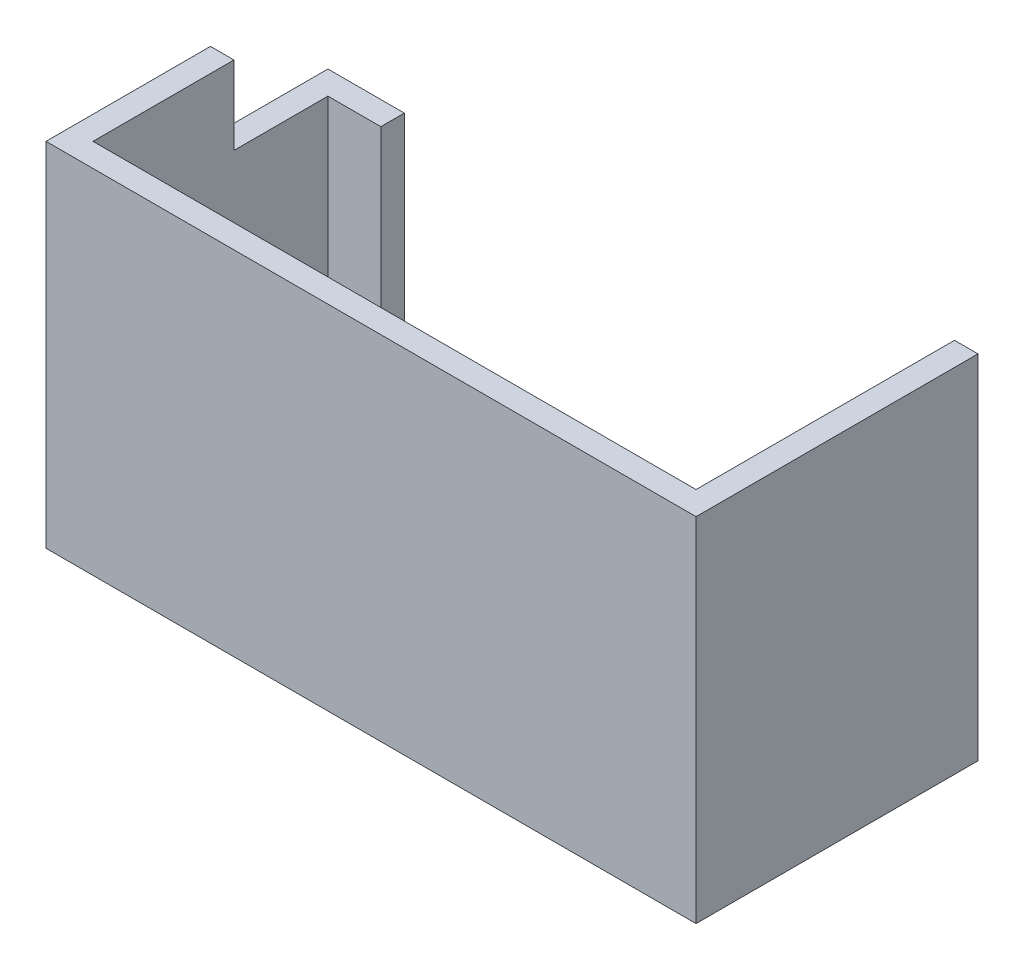
ISO-10303-21;
HEADER;
FILE_DESCRIPTION(('STEP AP214'),'2;1');
FILE_NAME('part.step','',(''),(''),'','','');
FILE_SCHEMA(('AUTOMOTIVE_DESIGN { 1 0 10303 214 1 1 1 1 }'));
ENDSEC;
DATA;
#1=APPLICATION_CONTEXT('core data for automotive mechanical design processes');
#2=APPLICATION_PROTOCOL_DEFINITION('international standard','automotive_design',2000,#1);
#3=PRODUCT_CONTEXT('',#1,'mechanical');
#4=PRODUCT('Part','Part','',(#3));
#5=PRODUCT_RELATED_PRODUCT_CATEGORY('part','',(#4));
#6=PRODUCT_DEFINITION_FORMATION('','',#4);
#7=PRODUCT_DEFINITION_CONTEXT('part definition',#1,'design');
#8=PRODUCT_DEFINITION('design','',#6,#7);
#9=PRODUCT_DEFINITION_SHAPE('','',#8);
#10=(LENGTH_UNIT() NAMED_UNIT(*) SI_UNIT(.MILLI.,.METRE.));
#11=(NAMED_UNIT(*) PLANE_ANGLE_UNIT() SI_UNIT($,.RADIAN.));
#12=(NAMED_UNIT(*) SI_UNIT($,.STERADIAN.) SOLID_ANGLE_UNIT());
#13=UNCERTAINTY_MEASURE_WITH_UNIT(LENGTH_MEASURE(1.E-05),#10,'distance_accuracy_value','');
#14=(GEOMETRIC_REPRESENTATION_CONTEXT(3) GLOBAL_UNCERTAINTY_ASSIGNED_CONTEXT((#13)) GLOBAL_UNIT_ASSIGNED_CONTEXT((#10,
#11,#12)) REPRESENTATION_CONTEXT('',''));
#15=CARTESIAN_POINT('',(0.,0.,0.));
#16=DIRECTION('',(0.,0.,1.));
#17=DIRECTION('',(1.,0.,0.));
#18=AXIS2_PLACEMENT_3D('',#15,#16,#17);
#19=CARTESIAN_POINT('',(0.,45.,0.));
#20=DIRECTION('',(0.,1.,0.));
#21=DIRECTION('',(0.,0.,1.));
#22=AXIS2_PLACEMENT_3D('',#19,#20,#21);
#23=PLANE('',#22);
#24=DIRECTION('',(-1.,0.,0.));
#25=VECTOR('',#24,1.);
#26=CARTESIAN_POINT('',(80.,45.,-33.));
#27=LINE('',#26,#25);
#28=CARTESIAN_POINT('',(80.,45.,-33.));
#29=VERTEX_POINT('',#28);
#30=CARTESIAN_POINT('',(77.,45.,-33.));
#31=VERTEX_POINT('',#30);
#32=EDGE_CURVE('E212',#29,#31,#27,.T.);
#33=ORIENTED_EDGE('',*,*,#32,.T.);
#34=DIRECTION('',(0.,0.,1.));
#35=VECTOR('',#34,1.);
#36=CARTESIAN_POINT('',(77.,45.,0.));
#37=LINE('',#36,#35);
#38=CARTESIAN_POINT('',(77.,45.,0.));
#39=VERTEX_POINT('',#38);
#40=EDGE_CURVE('E259',#31,#39,#37,.T.);
#41=ORIENTED_EDGE('',*,*,#40,.T.);
#42=DIRECTION('',(-1.,0.,0.));
#43=VECTOR('',#42,1.);
#44=CARTESIAN_POINT('',(0.,45.,0.));
#45=LINE('',#44,#43);
#46=CARTESIAN_POINT('',(0.,45.,0.));
#47=VERTEX_POINT('',#46);
#48=EDGE_CURVE('E256',#39,#47,#45,.T.);
#49=ORIENTED_EDGE('',*,*,#48,.T.);
#50=DIRECTION('',(0.,0.,-1.));
#51=VECTOR('',#50,1.);
#52=CARTESIAN_POINT('',(0.,45.,-30.));
#53=LINE('',#52,#51);
#54=CARTESIAN_POINT('',(0.,45.,-18.));
#55=VERTEX_POINT('',#54);
#56=EDGE_CURVE('E248',#47,#55,#53,.T.);
#57=ORIENTED_EDGE('',*,*,#56,.T.);
#58=DIRECTION('',(1.,0.,0.));
#59=VECTOR('',#58,1.);
#60=CARTESIAN_POINT('',(-3.,45.,-18.));
#61=LINE('',#60,#59);
#62=CARTESIAN_POINT('',(-3.,45.,-18.));
#63=VERTEX_POINT('',#62);
#64=EDGE_CURVE('E281',#63,#55,#61,.T.);
#65=ORIENTED_EDGE('',*,*,#64,.F.);
#66=DIRECTION('',(0.,0.,1.));
#67=VECTOR('',#66,1.);
#68=CARTESIAN_POINT('',(-3.,45.,-33.));
#69=LINE('',#68,#67);
#70=CARTESIAN_POINT('',(-3.,45.,3.));
#71=VERTEX_POINT('',#70);
#72=EDGE_CURVE('E247',#63,#71,#69,.T.);
#73=ORIENTED_EDGE('',*,*,#72,.T.);
#74=DIRECTION('',(1.,0.,0.));
#75=VECTOR('',#74,1.);
#76=CARTESIAN_POINT('',(-3.,45.,3.));
#77=LINE('',#76,#75);
#78=CARTESIAN_POINT('',(80.,45.,3.));
#79=VERTEX_POINT('',#78);
#80=EDGE_CURVE('E226',#71,#79,#77,.T.);
#81=ORIENTED_EDGE('',*,*,#80,.T.);
#82=DIRECTION('',(0.,0.,-1.));
#83=VECTOR('',#82,1.);
#84=CARTESIAN_POINT('',(80.,45.,3.));
#85=LINE('',#84,#83);
#86=EDGE_CURVE('E220',#79,#29,#85,.T.);
#87=ORIENTED_EDGE('',*,*,#86,.T.);
#88=EDGE_LOOP('',(#33,#41,#49,#57,#65,#73,#81,#87));
#89=FACE_BOUND('',#88,.T.);
#90=ADVANCED_FACE('F37',(#89),#23,.T.);
#91=CARTESIAN_POINT('',(0.,5.,0.));
#92=DIRECTION('',(1.,0.,0.));
#93=DIRECTION('',(0.,0.,-1.));
#94=AXIS2_PLACEMENT_3D('',#91,#92,#93);
#95=PLANE('',#94);
#96=DIRECTION('',(0.,0.,-1.));
#97=VECTOR('',#96,1.);
#98=CARTESIAN_POINT('',(0.,35.,0.));
#99=LINE('',#98,#97);
#100=CARTESIAN_POINT('',(0.,35.,-18.));
#101=VERTEX_POINT('',#100);
#102=CARTESIAN_POINT('',(0.,35.,-30.));
#103=VERTEX_POINT('',#102);
#104=EDGE_CURVE('E273',#101,#103,#99,.T.);
#105=ORIENTED_EDGE('',*,*,#104,.F.);
#106=DIRECTION('',(0.,1.,0.));
#107=VECTOR('',#106,1.);
#108=CARTESIAN_POINT('',(0.,5.,-18.));
#109=LINE('',#108,#107);
#110=EDGE_CURVE('E277',#101,#55,#109,.T.);
#111=ORIENTED_EDGE('',*,*,#110,.T.);
#112=ORIENTED_EDGE('',*,*,#56,.F.);
#113=DIRECTION('',(0.,-1.,0.));
#114=VECTOR('',#113,1.);
#115=CARTESIAN_POINT('',(0.,5.,0.));
#116=LINE('',#115,#114);
#117=CARTESIAN_POINT('',(0.,1.,0.));
#118=VERTEX_POINT('',#117);
#119=EDGE_CURVE('E181',#47,#118,#116,.T.);
#120=ORIENTED_EDGE('',*,*,#119,.T.);
#121=DIRECTION('',(0.,0.,-1.));
#122=VECTOR('',#121,1.);
#123=CARTESIAN_POINT('',(0.,1.,0.));
#124=LINE('',#123,#122);
#125=CARTESIAN_POINT('',(0.,1.,-30.));
#126=VERTEX_POINT('',#125);
#127=EDGE_CURVE('E252',#118,#126,#124,.T.);
#128=ORIENTED_EDGE('',*,*,#127,.T.);
#129=DIRECTION('',(0.,-1.,0.));
#130=VECTOR('',#129,1.);
#131=CARTESIAN_POINT('',(0.,5.,-30.));
#132=LINE('',#131,#130);
#133=EDGE_CURVE('E175',#103,#126,#132,.T.);
#134=ORIENTED_EDGE('',*,*,#133,.F.);
#135=EDGE_LOOP('',(#105,#111,#112,#120,#128,#134));
#136=FACE_BOUND('',#135,.T.);
#137=ADVANCED_FACE('F298',(#136),#95,.T.);
#138=CARTESIAN_POINT('',(0.,5.,0.));
#139=DIRECTION('',(0.,0.,-1.));
#140=DIRECTION('',(-1.,0.,0.));
#141=AXIS2_PLACEMENT_3D('',#138,#139,#140);
#142=PLANE('',#141);
#143=DIRECTION('',(0.,-1.,0.));
#144=VECTOR('',#143,1.);
#145=CARTESIAN_POINT('',(77.,5.,0.));
#146=LINE('',#145,#144);
#147=CARTESIAN_POINT('',(77.,1.,0.));
#148=VERTEX_POINT('',#147);
#149=EDGE_CURVE('E178',#39,#148,#146,.T.);
#150=ORIENTED_EDGE('',*,*,#149,.T.);
#151=DIRECTION('',(-1.,0.,0.));
#152=VECTOR('',#151,1.);
#153=CARTESIAN_POINT('',(0.,1.,0.));
#154=LINE('',#153,#152);
#155=EDGE_CURVE('E267',#148,#118,#154,.T.);
#156=ORIENTED_EDGE('',*,*,#155,.T.);
#157=ORIENTED_EDGE('',*,*,#119,.F.);
#158=ORIENTED_EDGE('',*,*,#48,.F.);
#159=EDGE_LOOP('',(#150,#156,#157,#158));
#160=FACE_BOUND('',#159,.T.);
#161=ADVANCED_FACE('F304',(#160),#142,.T.);
#162=CARTESIAN_POINT('',(77.,5.,0.));
#163=DIRECTION('',(-1.,0.,0.));
#164=DIRECTION('',(0.,0.,1.));
#165=AXIS2_PLACEMENT_3D('',#162,#163,#164);
#166=PLANE('',#165);
#167=ORIENTED_EDGE('',*,*,#40,.F.);
#168=DIRECTION('',(0.,-1.,0.));
#169=VECTOR('',#168,1.);
#170=CARTESIAN_POINT('',(77.,24.4,-33.));
#171=LINE('',#170,#169);
#172=CARTESIAN_POINT('',(77.,24.4,-33.));
#173=VERTEX_POINT('',#172);
#174=EDGE_CURVE('E149',#31,#173,#171,.T.);
#175=ORIENTED_EDGE('',*,*,#174,.T.);
#176=DIRECTION('',(0.,0.,-1.));
#177=VECTOR('',#176,1.);
#178=CARTESIAN_POINT('',(77.,24.4,3.001));
#179=LINE('',#178,#177);
#180=CARTESIAN_POINT('',(77.,24.4,-30.));
#181=VERTEX_POINT('',#180);
#182=EDGE_CURVE('E159',#181,#173,#179,.T.);
#183=ORIENTED_EDGE('',*,*,#182,.F.);
#184=DIRECTION('',(0.,-1.,0.));
#185=VECTOR('',#184,1.);
#186=CARTESIAN_POINT('',(77.,5.,-30.));
#187=LINE('',#186,#185);
#188=CARTESIAN_POINT('',(77.,1.,-30.));
#189=VERTEX_POINT('',#188);
#190=EDGE_CURVE('E157',#181,#189,#187,.T.);
#191=ORIENTED_EDGE('',*,*,#190,.T.);
#192=DIRECTION('',(0.,0.,1.));
#193=VECTOR('',#192,1.);
#194=CARTESIAN_POINT('',(77.,1.,0.));
#195=LINE('',#194,#193);
#196=EDGE_CURVE('E270',#189,#148,#195,.T.);
#197=ORIENTED_EDGE('',*,*,#196,.T.);
#198=ORIENTED_EDGE('',*,*,#149,.F.);
#199=EDGE_LOOP('',(#167,#175,#183,#191,#197,#198));
#200=FACE_BOUND('',#199,.T.);
#201=ADVANCED_FACE('F290',(#200),#166,.T.);
#202=CARTESIAN_POINT('',(0.,5.,-30.));
#203=DIRECTION('',(0.,0.,1.));
#204=DIRECTION('',(1.,0.,0.));
#205=AXIS2_PLACEMENT_3D('',#202,#203,#204);
#206=PLANE('',#205);
#207=DIRECTION('',(-1.,0.,0.));
#208=VECTOR('',#207,1.);
#209=CARTESIAN_POINT('',(77.,24.4,-30.));
#210=LINE('',#209,#208);
#211=CARTESIAN_POINT('',(70.2476744816459,24.4,-30.));
#212=VERTEX_POINT('',#211);
#213=EDGE_CURVE('E144',#181,#212,#210,.T.);
#214=ORIENTED_EDGE('',*,*,#213,.T.);
#215=DIRECTION('',(0.,-1.,0.));
#216=VECTOR('',#215,1.);
#217=CARTESIAN_POINT('',(70.2476744816459,45.,-30.));
#218=LINE('',#217,#216);
#219=CARTESIAN_POINT('',(70.2476744816459,5.,-30.));
#220=VERTEX_POINT('',#219);
#221=EDGE_CURVE('E155',#212,#220,#218,.T.);
#222=ORIENTED_EDGE('',*,*,#221,.T.);
#223=DIRECTION('',(-1.,0.,0.));
#224=VECTOR('',#223,1.);
#225=CARTESIAN_POINT('',(0.,5.,-30.));
#226=LINE('',#225,#224);
#227=CARTESIAN_POINT('',(6.7523255183541,5.,-30.));
#228=VERTEX_POINT('',#227);
#229=EDGE_CURVE('E168',#220,#228,#226,.T.);
#230=ORIENTED_EDGE('',*,*,#229,.T.);
#231=DIRECTION('',(0.,-1.,0.));
#232=VECTOR('',#231,1.);
#233=CARTESIAN_POINT('',(6.7523255183541,45.,-30.));
#234=LINE('',#233,#232);
#235=CARTESIAN_POINT('',(6.7523255183541,35.,-30.));
#236=VERTEX_POINT('',#235);
#237=EDGE_CURVE('E166',#236,#228,#234,.T.);
#238=ORIENTED_EDGE('',*,*,#237,.F.);
#239=DIRECTION('',(1.,0.,0.));
#240=VECTOR('',#239,1.);
#241=CARTESIAN_POINT('',(0.,35.,-30.));
#242=LINE('',#241,#240);
#243=EDGE_CURVE('E275',#103,#236,#242,.T.);
#244=ORIENTED_EDGE('',*,*,#243,.F.);
#245=ORIENTED_EDGE('',*,*,#133,.T.);
#246=DIRECTION('',(1.,0.,0.));
#247=VECTOR('',#246,1.);
#248=CARTESIAN_POINT('',(0.,1.,-30.));
#249=LINE('',#248,#247);
#250=EDGE_CURVE('E11',#126,#189,#249,.T.);
#251=ORIENTED_EDGE('',*,*,#250,.T.);
#252=ORIENTED_EDGE('',*,*,#190,.F.);
#253=EDGE_LOOP('',(#214,#222,#230,#238,#244,#245,#251,#252));
#254=FACE_BOUND('',#253,.T.);
#255=ADVANCED_FACE('F153',(#254),#206,.T.);
#256=CARTESIAN_POINT('',(0.,5.,0.));
#257=DIRECTION('',(0.,-1.,0.));
#258=DIRECTION('',(0.,0.,-1.));
#259=AXIS2_PLACEMENT_3D('',#256,#257,#258);
#260=PLANE('',#259);
#261=DIRECTION('',(0.,0.,-1.));
#262=VECTOR('',#261,1.);
#263=CARTESIAN_POINT('',(6.7523255183541,5.,-33.));
#264=LINE('',#263,#262);
#265=CARTESIAN_POINT('',(6.7523255183541,5.,-33.));
#266=VERTEX_POINT('',#265);
#267=EDGE_CURVE('E246',#228,#266,#264,.T.);
#268=ORIENTED_EDGE('',*,*,#267,.F.);
#269=ORIENTED_EDGE('',*,*,#229,.F.);
#270=DIRECTION('',(0.,0.,1.));
#271=VECTOR('',#270,1.);
#272=CARTESIAN_POINT('',(70.2476744816459,5.,-33.));
#273=LINE('',#272,#271);
#274=CARTESIAN_POINT('',(70.2476744816459,5.,-33.));
#275=VERTEX_POINT('',#274);
#276=EDGE_CURVE('E164',#275,#220,#273,.T.);
#277=ORIENTED_EDGE('',*,*,#276,.F.);
#278=DIRECTION('',(-1.,0.,0.));
#279=VECTOR('',#278,1.);
#280=CARTESIAN_POINT('',(-3.,5.,-33.));
#281=LINE('',#280,#279);
#282=EDGE_CURVE('E185',#275,#266,#281,.T.);
#283=ORIENTED_EDGE('',*,*,#282,.T.);
#284=EDGE_LOOP('',(#268,#269,#277,#283));
#285=FACE_BOUND('',#284,.T.);
#286=ADVANCED_FACE('F292',(#285),#260,.F.);
#287=CARTESIAN_POINT('',(0.,0.,0.));
#288=DIRECTION('',(0.,-1.,0.));
#289=DIRECTION('',(0.,0.,-1.));
#290=AXIS2_PLACEMENT_3D('',#287,#288,#289);
#291=PLANE('',#290);
#292=DIRECTION('',(0.,0.,-1.));
#293=VECTOR('',#292,1.);
#294=CARTESIAN_POINT('',(80.,0.,3.));
#295=LINE('',#294,#293);
#296=CARTESIAN_POINT('',(80.,0.,3.));
#297=VERTEX_POINT('',#296);
#298=CARTESIAN_POINT('',(80.,0.,-33.));
#299=VERTEX_POINT('',#298);
#300=EDGE_CURVE('E184',#297,#299,#295,.T.);
#301=ORIENTED_EDGE('',*,*,#300,.F.);
#302=DIRECTION('',(1.,0.,0.));
#303=VECTOR('',#302,1.);
#304=CARTESIAN_POINT('',(-3.,0.,3.));
#305=LINE('',#304,#303);
#306=CARTESIAN_POINT('',(-3.,0.,3.));
#307=VERTEX_POINT('',#306);
#308=EDGE_CURVE('E189',#307,#297,#305,.T.);
#309=ORIENTED_EDGE('',*,*,#308,.F.);
#310=DIRECTION('',(0.,0.,1.));
#311=VECTOR('',#310,1.);
#312=CARTESIAN_POINT('',(-3.,0.,3.));
#313=LINE('',#312,#311);
#314=CARTESIAN_POINT('',(-3.,0.,-33.));
#315=VERTEX_POINT('',#314);
#316=EDGE_CURVE('E195',#315,#307,#313,.T.);
#317=ORIENTED_EDGE('',*,*,#316,.F.);
#318=DIRECTION('',(-1.,0.,0.));
#319=VECTOR('',#318,1.);
#320=CARTESIAN_POINT('',(-3.,0.,-33.));
#321=LINE('',#320,#319);
#322=EDGE_CURVE('E192',#299,#315,#321,.T.);
#323=ORIENTED_EDGE('',*,*,#322,.F.);
#324=EDGE_LOOP('',(#301,#309,#317,#323));
#325=FACE_BOUND('',#324,.T.);
#326=ADVANCED_FACE('F218',(#325),#291,.T.);
#327=CARTESIAN_POINT('',(80.,5.,3.));
#328=DIRECTION('',(-1.,0.,0.));
#329=DIRECTION('',(0.,0.,1.));
#330=AXIS2_PLACEMENT_3D('',#327,#328,#329);
#331=PLANE('',#330);
#332=ORIENTED_EDGE('',*,*,#300,.T.);
#333=DIRECTION('',(0.,-1.,0.));
#334=VECTOR('',#333,1.);
#335=CARTESIAN_POINT('',(80.,5.,-33.));
#336=LINE('',#335,#334);
#337=EDGE_CURVE('E45',#29,#299,#336,.T.);
#338=ORIENTED_EDGE('',*,*,#337,.F.);
#339=ORIENTED_EDGE('',*,*,#86,.F.);
#340=DIRECTION('',(0.,-1.,0.));
#341=VECTOR('',#340,1.);
#342=CARTESIAN_POINT('',(80.,5.,3.));
#343=LINE('',#342,#341);
#344=EDGE_CURVE('E188',#79,#297,#343,.T.);
#345=ORIENTED_EDGE('',*,*,#344,.T.);
#346=EDGE_LOOP('',(#332,#338,#339,#345));
#347=FACE_BOUND('',#346,.T.);
#348=ADVANCED_FACE('F39',(#347),#331,.F.);
#349=CARTESIAN_POINT('',(-3.,5.,-33.));
#350=DIRECTION('',(0.,0.,1.));
#351=DIRECTION('',(1.,0.,0.));
#352=AXIS2_PLACEMENT_3D('',#349,#350,#351);
#353=PLANE('',#352);
#354=DIRECTION('',(0.,-1.,0.));
#355=VECTOR('',#354,1.);
#356=CARTESIAN_POINT('',(70.2476744816459,45.,-33.));
#357=LINE('',#356,#355);
#358=CARTESIAN_POINT('',(70.2476744816459,24.4,-33.));
#359=VERTEX_POINT('',#358);
#360=EDGE_CURVE('E165',#359,#275,#357,.T.);
#361=ORIENTED_EDGE('',*,*,#360,.F.);
#362=DIRECTION('',(-1.,0.,0.));
#363=VECTOR('',#362,1.);
#364=CARTESIAN_POINT('',(77.,24.4,-33.));
#365=LINE('',#364,#363);
#366=EDGE_CURVE('E52',#173,#359,#365,.T.);
#367=ORIENTED_EDGE('',*,*,#366,.F.);
#368=ORIENTED_EDGE('',*,*,#174,.F.);
#369=ORIENTED_EDGE('',*,*,#32,.F.);
#370=ORIENTED_EDGE('',*,*,#337,.T.);
#371=ORIENTED_EDGE('',*,*,#322,.T.);
#372=DIRECTION('',(0.,-1.,0.));
#373=VECTOR('',#372,1.);
#374=CARTESIAN_POINT('',(-3.,5.,-33.));
#375=LINE('',#374,#373);
#376=CARTESIAN_POINT('',(-3.,35.,-33.));
#377=VERTEX_POINT('',#376);
#378=EDGE_CURVE('E203',#377,#315,#375,.T.);
#379=ORIENTED_EDGE('',*,*,#378,.F.);
#380=DIRECTION('',(-1.,0.,0.));
#381=VECTOR('',#380,1.);
#382=CARTESIAN_POINT('',(-3.,35.,-33.));
#383=LINE('',#382,#381);
#384=CARTESIAN_POINT('',(6.7523255183541,35.,-33.));
#385=VERTEX_POINT('',#384);
#386=EDGE_CURVE('E158',#385,#377,#383,.T.);
#387=ORIENTED_EDGE('',*,*,#386,.F.);
#388=DIRECTION('',(0.,-1.,0.));
#389=VECTOR('',#388,1.);
#390=CARTESIAN_POINT('',(6.7523255183541,45.,-33.));
#391=LINE('',#390,#389);
#392=EDGE_CURVE('E170',#385,#266,#391,.T.);
#393=ORIENTED_EDGE('',*,*,#392,.T.);
#394=ORIENTED_EDGE('',*,*,#282,.F.);
#395=EDGE_LOOP('',(#361,#367,#368,#369,#370,#371,#379,#387,#393,#394));
#396=FACE_BOUND('',#395,.T.);
#397=ADVANCED_FACE('F207',(#396),#353,.F.);
#398=CARTESIAN_POINT('',(-3.,5.,3.));
#399=DIRECTION('',(1.,0.,0.));
#400=DIRECTION('',(0.,0.,-1.));
#401=AXIS2_PLACEMENT_3D('',#398,#399,#400);
#402=PLANE('',#401);
#403=DIRECTION('',(0.,1.,0.));
#404=VECTOR('',#403,1.);
#405=CARTESIAN_POINT('',(-3.,35.,-18.));
#406=LINE('',#405,#404);
#407=CARTESIAN_POINT('',(-3.,35.,-18.));
#408=VERTEX_POINT('',#407);
#409=EDGE_CURVE('E60',#408,#63,#406,.T.);
#410=ORIENTED_EDGE('',*,*,#409,.F.);
#411=DIRECTION('',(0.,0.,-1.));
#412=VECTOR('',#411,1.);
#413=CARTESIAN_POINT('',(-3.,35.,-18.));
#414=LINE('',#413,#412);
#415=EDGE_CURVE('E232',#408,#377,#414,.T.);
#416=ORIENTED_EDGE('',*,*,#415,.T.);
#417=ORIENTED_EDGE('',*,*,#378,.T.);
#418=ORIENTED_EDGE('',*,*,#316,.T.);
#419=DIRECTION('',(0.,-1.,0.));
#420=VECTOR('',#419,1.);
#421=CARTESIAN_POINT('',(-3.,5.,3.));
#422=LINE('',#421,#420);
#423=EDGE_CURVE('E201',#71,#307,#422,.T.);
#424=ORIENTED_EDGE('',*,*,#423,.F.);
#425=ORIENTED_EDGE('',*,*,#72,.F.);
#426=EDGE_LOOP('',(#410,#416,#417,#418,#424,#425));
#427=FACE_BOUND('',#426,.T.);
#428=ADVANCED_FACE('F229',(#427),#402,.F.);
#429=CARTESIAN_POINT('',(-3.,5.,3.));
#430=DIRECTION('',(0.,0.,-1.));
#431=DIRECTION('',(-1.,0.,0.));
#432=AXIS2_PLACEMENT_3D('',#429,#430,#431);
#433=PLANE('',#432);
#434=ORIENTED_EDGE('',*,*,#308,.T.);
#435=ORIENTED_EDGE('',*,*,#344,.F.);
#436=ORIENTED_EDGE('',*,*,#80,.F.);
#437=ORIENTED_EDGE('',*,*,#423,.T.);
#438=EDGE_LOOP('',(#434,#435,#436,#437));
#439=FACE_BOUND('',#438,.T.);
#440=ADVANCED_FACE('F224',(#439),#433,.F.);
#441=CARTESIAN_POINT('',(70.2476744816459,45.,-33.));
#442=DIRECTION('',(1.,0.,0.));
#443=DIRECTION('',(0.,0.,-1.));
#444=AXIS2_PLACEMENT_3D('',#441,#442,#443);
#445=PLANE('',#444);
#446=ORIENTED_EDGE('',*,*,#221,.F.);
#447=DIRECTION('',(0.,0.,1.));
#448=VECTOR('',#447,1.);
#449=CARTESIAN_POINT('',(70.2476744816459,24.4,3.001));
#450=LINE('',#449,#448);
#451=EDGE_CURVE('E141',#359,#212,#450,.T.);
#452=ORIENTED_EDGE('',*,*,#451,.F.);
#453=ORIENTED_EDGE('',*,*,#360,.T.);
#454=ORIENTED_EDGE('',*,*,#276,.T.);
#455=EDGE_LOOP('',(#446,#452,#453,#454));
#456=FACE_BOUND('',#455,.T.);
#457=ADVANCED_FACE('F162',(#456),#445,.F.);
#458=CARTESIAN_POINT('',(6.7523255183541,45.,-33.));
#459=DIRECTION('',(-1.,0.,0.));
#460=DIRECTION('',(0.,0.,1.));
#461=AXIS2_PLACEMENT_3D('',#458,#459,#460);
#462=PLANE('',#461);
#463=ORIENTED_EDGE('',*,*,#392,.F.);
#464=DIRECTION('',(0.,0.,-1.));
#465=VECTOR('',#464,1.);
#466=CARTESIAN_POINT('',(6.7523255183541,35.,-18.));
#467=LINE('',#466,#465);
#468=EDGE_CURVE('E243',#236,#385,#467,.T.);
#469=ORIENTED_EDGE('',*,*,#468,.F.);
#470=ORIENTED_EDGE('',*,*,#237,.T.);
#471=ORIENTED_EDGE('',*,*,#267,.T.);
#472=EDGE_LOOP('',(#463,#469,#470,#471));
#473=FACE_BOUND('',#472,.T.);
#474=ADVANCED_FACE('F242',(#473),#462,.F.);
#475=CARTESIAN_POINT('',(0.,1.,0.));
#476=DIRECTION('',(0.,-1.,0.));
#477=DIRECTION('',(0.,0.,-1.));
#478=AXIS2_PLACEMENT_3D('',#475,#476,#477);
#479=PLANE('',#478);
#480=ORIENTED_EDGE('',*,*,#127,.F.);
#481=ORIENTED_EDGE('',*,*,#155,.F.);
#482=ORIENTED_EDGE('',*,*,#196,.F.);
#483=ORIENTED_EDGE('',*,*,#250,.F.);
#484=EDGE_LOOP('',(#480,#481,#482,#483));
#485=FACE_BOUND('',#484,.T.);
#486=ADVANCED_FACE('F301',(#485),#479,.F.);
#487=CARTESIAN_POINT('',(-3.,35.,-18.));
#488=DIRECTION('',(0.,-1.,0.));
#489=DIRECTION('',(0.,0.,-1.));
#490=AXIS2_PLACEMENT_3D('',#487,#488,#489);
#491=PLANE('',#490);
#492=ORIENTED_EDGE('',*,*,#104,.T.);
#493=ORIENTED_EDGE('',*,*,#243,.T.);
#494=ORIENTED_EDGE('',*,*,#468,.T.);
#495=ORIENTED_EDGE('',*,*,#386,.T.);
#496=ORIENTED_EDGE('',*,*,#415,.F.);
#497=DIRECTION('',(-1.,0.,0.));
#498=VECTOR('',#497,1.);
#499=CARTESIAN_POINT('',(-3.,35.,-18.));
#500=LINE('',#499,#498);
#501=EDGE_CURVE('E237',#101,#408,#500,.T.);
#502=ORIENTED_EDGE('',*,*,#501,.F.);
#503=EDGE_LOOP('',(#492,#493,#494,#495,#496,#502));
#504=FACE_BOUND('',#503,.T.);
#505=ADVANCED_FACE('F309',(#504),#491,.F.);
#506=CARTESIAN_POINT('',(0.,0.,-18.));
#507=DIRECTION('',(0.,0.,-1.));
#508=DIRECTION('',(-1.,0.,0.));
#509=AXIS2_PLACEMENT_3D('',#506,#507,#508);
#510=PLANE('',#509);
#511=ORIENTED_EDGE('',*,*,#501,.T.);
#512=ORIENTED_EDGE('',*,*,#409,.T.);
#513=ORIENTED_EDGE('',*,*,#64,.T.);
#514=ORIENTED_EDGE('',*,*,#110,.F.);
#515=EDGE_LOOP('',(#511,#512,#513,#514));
#516=FACE_BOUND('',#515,.T.);
#517=ADVANCED_FACE('F307',(#516),#510,.T.);
#518=CARTESIAN_POINT('',(77.,24.4,3.001));
#519=DIRECTION('',(0.,-1.,0.));
#520=DIRECTION('',(0.,0.,-1.));
#521=AXIS2_PLACEMENT_3D('',#518,#519,#520);
#522=PLANE('',#521);
#523=ORIENTED_EDGE('',*,*,#182,.T.);
#524=ORIENTED_EDGE('',*,*,#366,.T.);
#525=ORIENTED_EDGE('',*,*,#451,.T.);
#526=ORIENTED_EDGE('',*,*,#213,.F.);
#527=EDGE_LOOP('',(#523,#524,#525,#526));
#528=FACE_BOUND('',#527,.T.);
#529=ADVANCED_FACE('F143',(#528),#522,.F.);
#530=CLOSED_SHELL('',(#90,#137,#161,#201,#255,#286,#326,#348,#397,#428,#440,#457,#474,#486,#505,
#517,#529));
#531=MANIFOLD_SOLID_BREP('B2',#530);
#532=ADVANCED_BREP_SHAPE_REPRESENTATION('',(#18,#531),#14);
#533=SHAPE_DEFINITION_REPRESENTATION(#9,#532);
ENDSEC;
END-ISO-10303-21;
